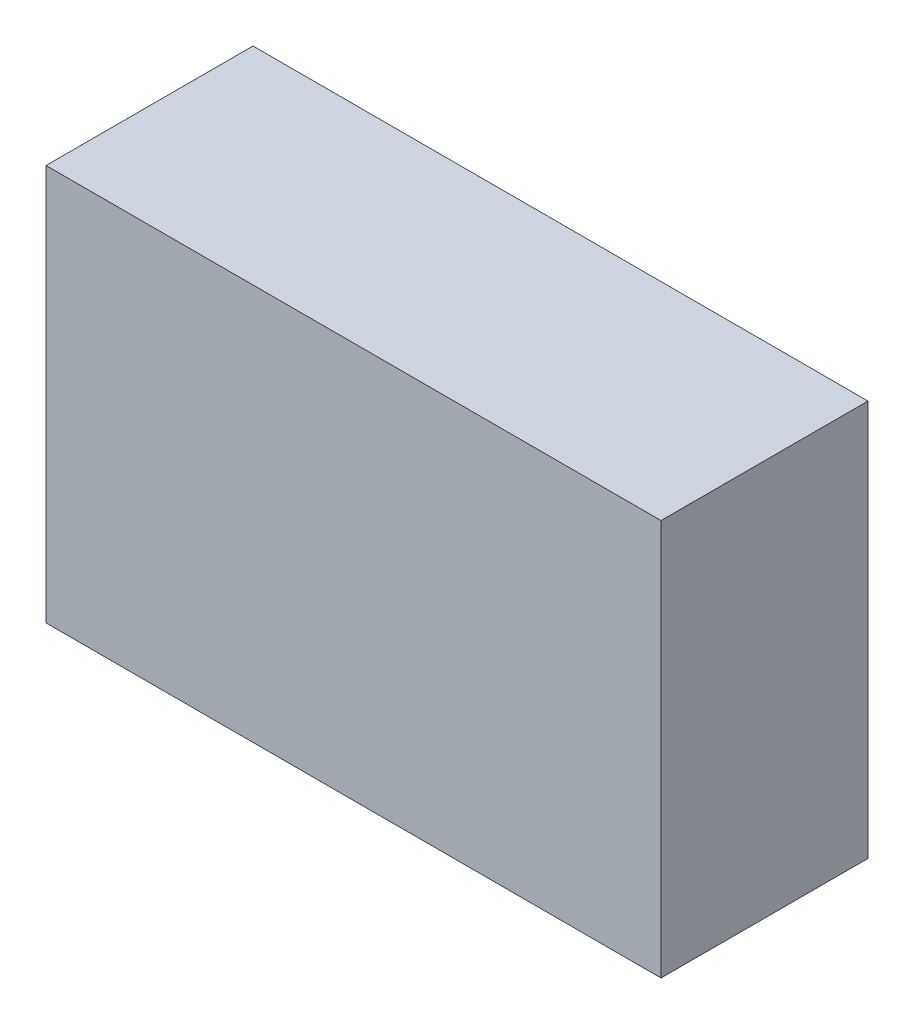
ISO-10303-21;
HEADER;
FILE_DESCRIPTION(('STEP AP214'),'2;1');
FILE_NAME('part.step','',(''),(''),'','','');
FILE_SCHEMA(('AUTOMOTIVE_DESIGN { 1 0 10303 214 1 1 1 1 }'));
ENDSEC;
DATA;
#1=APPLICATION_CONTEXT('core data for automotive mechanical design processes');
#2=APPLICATION_PROTOCOL_DEFINITION('international standard','automotive_design',2000,#1);
#3=PRODUCT_CONTEXT('',#1,'mechanical');
#4=PRODUCT('Part','Part','',(#3));
#5=PRODUCT_RELATED_PRODUCT_CATEGORY('part','',(#4));
#6=PRODUCT_DEFINITION_FORMATION('','',#4);
#7=PRODUCT_DEFINITION_CONTEXT('part definition',#1,'design');
#8=PRODUCT_DEFINITION('design','',#6,#7);
#9=PRODUCT_DEFINITION_SHAPE('','',#8);
#10=(LENGTH_UNIT() NAMED_UNIT(*) SI_UNIT(.MILLI.,.METRE.));
#11=(NAMED_UNIT(*) PLANE_ANGLE_UNIT() SI_UNIT($,.RADIAN.));
#12=(NAMED_UNIT(*) SI_UNIT($,.STERADIAN.) SOLID_ANGLE_UNIT());
#13=UNCERTAINTY_MEASURE_WITH_UNIT(LENGTH_MEASURE(1.E-05),#10,'distance_accuracy_value','');
#14=(GEOMETRIC_REPRESENTATION_CONTEXT(3) GLOBAL_UNCERTAINTY_ASSIGNED_CONTEXT((#13)) GLOBAL_UNIT_ASSIGNED_CONTEXT((#10,
#11,#12)) REPRESENTATION_CONTEXT('',''));
#15=CARTESIAN_POINT('',(0.,0.,0.));
#16=DIRECTION('',(0.,0.,1.));
#17=DIRECTION('',(1.,0.,0.));
#18=AXIS2_PLACEMENT_3D('',#15,#16,#17);
#19=CARTESIAN_POINT('',(0.64,-0.27,0.7));
#20=DIRECTION('',(0.,0.,1.));
#21=DIRECTION('',(1.,0.,0.));
#22=AXIS2_PLACEMENT_3D('',#19,#20,#21);
#23=PLANE('',#22);
#24=DIRECTION('',(1.,0.,0.));
#25=VECTOR('',#24,1.);
#26=CARTESIAN_POINT('',(-0.4,-0.94,0.7));
#27=LINE('',#26,#25);
#28=CARTESIAN_POINT('',(-0.4,-0.94,0.7));
#29=VERTEX_POINT('',#28);
#30=CARTESIAN_POINT('',(1.68,-0.94,0.7));
#31=VERTEX_POINT('',#30);
#32=EDGE_CURVE('E86',#29,#31,#27,.T.);
#33=ORIENTED_EDGE('',*,*,#32,.T.);
#34=DIRECTION('',(0.,1.,0.));
#35=VECTOR('',#34,1.);
#36=CARTESIAN_POINT('',(1.68,-0.94,0.7));
#37=LINE('',#36,#35);
#38=CARTESIAN_POINT('',(1.68,0.4,0.7));
#39=VERTEX_POINT('',#38);
#40=EDGE_CURVE('E19',#31,#39,#37,.T.);
#41=ORIENTED_EDGE('',*,*,#40,.T.);
#42=DIRECTION('',(-1.,0.,0.));
#43=VECTOR('',#42,1.);
#44=CARTESIAN_POINT('',(1.68,0.4,0.7));
#45=LINE('',#44,#43);
#46=CARTESIAN_POINT('',(-0.4,0.4,0.7));
#47=VERTEX_POINT('',#46);
#48=EDGE_CURVE('E70',#39,#47,#45,.T.);
#49=ORIENTED_EDGE('',*,*,#48,.T.);
#50=DIRECTION('',(0.,-1.,0.));
#51=VECTOR('',#50,1.);
#52=CARTESIAN_POINT('',(-0.4,0.4,0.7));
#53=LINE('',#52,#51);
#54=EDGE_CURVE('E11',#47,#29,#53,.T.);
#55=ORIENTED_EDGE('',*,*,#54,.T.);
#56=EDGE_LOOP('',(#33,#41,#49,#55));
#57=FACE_BOUND('',#56,.T.);
#58=ADVANCED_FACE('F16',(#57),#23,.T.);
#59=CARTESIAN_POINT('',(0.64,-0.27,0.));
#60=DIRECTION('',(0.,0.,1.));
#61=DIRECTION('',(1.,0.,0.));
#62=AXIS2_PLACEMENT_3D('',#59,#60,#61);
#63=PLANE('',#62);
#64=DIRECTION('',(1.,0.,0.));
#65=VECTOR('',#64,1.);
#66=CARTESIAN_POINT('',(-0.4,-0.94,0.));
#67=LINE('',#66,#65);
#68=CARTESIAN_POINT('',(-0.4,-0.94,0.));
#69=VERTEX_POINT('',#68);
#70=CARTESIAN_POINT('',(1.68,-0.94,0.));
#71=VERTEX_POINT('',#70);
#72=EDGE_CURVE('E73',#69,#71,#67,.T.);
#73=ORIENTED_EDGE('',*,*,#72,.F.);
#74=DIRECTION('',(0.,-1.,0.));
#75=VECTOR('',#74,1.);
#76=CARTESIAN_POINT('',(-0.4,0.4,0.));
#77=LINE('',#76,#75);
#78=CARTESIAN_POINT('',(-0.4,0.4,0.));
#79=VERTEX_POINT('',#78);
#80=EDGE_CURVE('E26',#79,#69,#77,.T.);
#81=ORIENTED_EDGE('',*,*,#80,.F.);
#82=DIRECTION('',(-1.,0.,0.));
#83=VECTOR('',#82,1.);
#84=CARTESIAN_POINT('',(1.68,0.4,0.));
#85=LINE('',#84,#83);
#86=CARTESIAN_POINT('',(1.68,0.4,0.));
#87=VERTEX_POINT('',#86);
#88=EDGE_CURVE('E104',#87,#79,#85,.T.);
#89=ORIENTED_EDGE('',*,*,#88,.F.);
#90=DIRECTION('',(0.,1.,0.));
#91=VECTOR('',#90,1.);
#92=CARTESIAN_POINT('',(1.68,-0.94,0.));
#93=LINE('',#92,#91);
#94=EDGE_CURVE('E76',#71,#87,#93,.T.);
#95=ORIENTED_EDGE('',*,*,#94,.F.);
#96=EDGE_LOOP('',(#73,#81,#89,#95));
#97=FACE_BOUND('',#96,.T.);
#98=ADVANCED_FACE('F74',(#97),#63,.F.);
#99=CARTESIAN_POINT('',(-0.4,0.4,0.));
#100=DIRECTION('',(1.,0.,0.));
#101=DIRECTION('',(0.,1.,0.));
#102=AXIS2_PLACEMENT_3D('',#99,#100,#101);
#103=PLANE('',#102);
#104=DIRECTION('',(0.,0.,1.));
#105=VECTOR('',#104,1.);
#106=CARTESIAN_POINT('',(-0.4,0.4,0.));
#107=LINE('',#106,#105);
#108=EDGE_CURVE('E66',#79,#47,#107,.T.);
#109=ORIENTED_EDGE('',*,*,#108,.F.);
#110=ORIENTED_EDGE('',*,*,#80,.T.);
#111=DIRECTION('',(0.,0.,1.));
#112=VECTOR('',#111,1.);
#113=CARTESIAN_POINT('',(-0.4,-0.94,0.));
#114=LINE('',#113,#112);
#115=EDGE_CURVE('E64',#69,#29,#114,.T.);
#116=ORIENTED_EDGE('',*,*,#115,.T.);
#117=ORIENTED_EDGE('',*,*,#54,.F.);
#118=EDGE_LOOP('',(#109,#110,#116,#117));
#119=FACE_BOUND('',#118,.T.);
#120=ADVANCED_FACE('F62',(#119),#103,.F.);
#121=CARTESIAN_POINT('',(1.68,0.4,0.));
#122=DIRECTION('',(0.,-1.,0.));
#123=DIRECTION('',(0.,0.,-1.));
#124=AXIS2_PLACEMENT_3D('',#121,#122,#123);
#125=PLANE('',#124);
#126=DIRECTION('',(0.,0.,1.));
#127=VECTOR('',#126,1.);
#128=CARTESIAN_POINT('',(1.68,0.4,0.));
#129=LINE('',#128,#127);
#130=EDGE_CURVE('E97',#87,#39,#129,.T.);
#131=ORIENTED_EDGE('',*,*,#130,.F.);
#132=ORIENTED_EDGE('',*,*,#88,.T.);
#133=ORIENTED_EDGE('',*,*,#108,.T.);
#134=ORIENTED_EDGE('',*,*,#48,.F.);
#135=EDGE_LOOP('',(#131,#132,#133,#134));
#136=FACE_BOUND('',#135,.T.);
#137=ADVANCED_FACE('F119',(#136),#125,.F.);
#138=CARTESIAN_POINT('',(1.68,-0.94,0.));
#139=DIRECTION('',(-1.,0.,0.));
#140=DIRECTION('',(0.,0.,1.));
#141=AXIS2_PLACEMENT_3D('',#138,#139,#140);
#142=PLANE('',#141);
#143=DIRECTION('',(0.,0.,1.));
#144=VECTOR('',#143,1.);
#145=CARTESIAN_POINT('',(1.68,-0.94,0.));
#146=LINE('',#145,#144);
#147=EDGE_CURVE('E81',#71,#31,#146,.T.);
#148=ORIENTED_EDGE('',*,*,#147,.F.);
#149=ORIENTED_EDGE('',*,*,#94,.T.);
#150=ORIENTED_EDGE('',*,*,#130,.T.);
#151=ORIENTED_EDGE('',*,*,#40,.F.);
#152=EDGE_LOOP('',(#148,#149,#150,#151));
#153=FACE_BOUND('',#152,.T.);
#154=ADVANCED_FACE('F118',(#153),#142,.F.);
#155=CARTESIAN_POINT('',(-0.4,-0.94,0.));
#156=DIRECTION('',(0.,1.,0.));
#157=DIRECTION('',(1.,0.,0.));
#158=AXIS2_PLACEMENT_3D('',#155,#156,#157);
#159=PLANE('',#158);
#160=ORIENTED_EDGE('',*,*,#115,.F.);
#161=ORIENTED_EDGE('',*,*,#72,.T.);
#162=ORIENTED_EDGE('',*,*,#147,.T.);
#163=ORIENTED_EDGE('',*,*,#32,.F.);
#164=EDGE_LOOP('',(#160,#161,#162,#163));
#165=FACE_BOUND('',#164,.T.);
#166=ADVANCED_FACE('F84',(#165),#159,.F.);
#167=CLOSED_SHELL('',(#58,#98,#120,#137,#154,#166));
#168=MANIFOLD_SOLID_BREP('B1',#167);
#169=ADVANCED_BREP_SHAPE_REPRESENTATION('',(#18,#168),#14);
#170=SHAPE_DEFINITION_REPRESENTATION(#9,#169);
ENDSEC;
END-ISO-10303-21;
